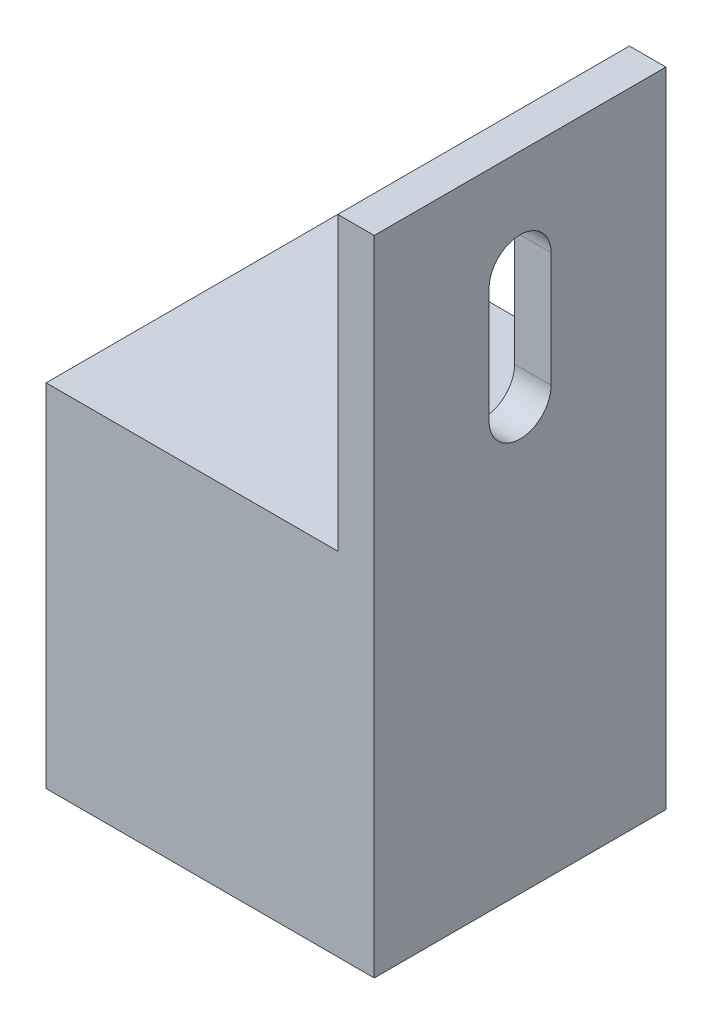
ISO-10303-21;
HEADER;
FILE_DESCRIPTION(('STEP AP214'),'2;1');
FILE_NAME('part.step','',(''),(''),'','','');
FILE_SCHEMA(('AUTOMOTIVE_DESIGN { 1 0 10303 214 1 1 1 1 }'));
ENDSEC;
DATA;
#1=APPLICATION_CONTEXT('core data for automotive mechanical design processes');
#2=APPLICATION_PROTOCOL_DEFINITION('international standard','automotive_design',2000,#1);
#3=PRODUCT_CONTEXT('',#1,'mechanical');
#4=PRODUCT('Part','Part','',(#3));
#5=PRODUCT_RELATED_PRODUCT_CATEGORY('part','',(#4));
#6=PRODUCT_DEFINITION_FORMATION('','',#4);
#7=PRODUCT_DEFINITION_CONTEXT('part definition',#1,'design');
#8=PRODUCT_DEFINITION('design','',#6,#7);
#9=PRODUCT_DEFINITION_SHAPE('','',#8);
#10=(LENGTH_UNIT() NAMED_UNIT(*) SI_UNIT(.MILLI.,.METRE.));
#11=(NAMED_UNIT(*) PLANE_ANGLE_UNIT() SI_UNIT($,.RADIAN.));
#12=(NAMED_UNIT(*) SI_UNIT($,.STERADIAN.) SOLID_ANGLE_UNIT());
#13=UNCERTAINTY_MEASURE_WITH_UNIT(LENGTH_MEASURE(1.E-05),#10,'distance_accuracy_value','');
#14=(GEOMETRIC_REPRESENTATION_CONTEXT(3) GLOBAL_UNCERTAINTY_ASSIGNED_CONTEXT((#13)) GLOBAL_UNIT_ASSIGNED_CONTEXT((#10,
#11,#12)) REPRESENTATION_CONTEXT('',''));
#15=CARTESIAN_POINT('',(0.,0.,0.));
#16=DIRECTION('',(0.,0.,1.));
#17=DIRECTION('',(1.,0.,0.));
#18=AXIS2_PLACEMENT_3D('',#15,#16,#17);
#19=CARTESIAN_POINT('',(-12.7,30.6,-12.7));
#20=DIRECTION('',(0.,0.,1.));
#21=DIRECTION('',(1.,0.,0.));
#22=AXIS2_PLACEMENT_3D('',#19,#20,#21);
#23=PLANE('',#22);
#24=DIRECTION('',(-1.,0.,0.));
#25=VECTOR('',#24,1.);
#26=CARTESIAN_POINT('',(-12.7,0.,-12.7));
#27=LINE('',#26,#25);
#28=CARTESIAN_POINT('',(15.875,0.,-12.7));
#29=VERTEX_POINT('',#28);
#30=CARTESIAN_POINT('',(-12.7,0.,-12.7));
#31=VERTEX_POINT('',#30);
#32=EDGE_CURVE('E67',#29,#31,#27,.T.);
#33=ORIENTED_EDGE('',*,*,#32,.T.);
#34=DIRECTION('',(0.,-1.,0.));
#35=VECTOR('',#34,1.);
#36=CARTESIAN_POINT('',(-12.7,30.6,-12.7));
#37=LINE('',#36,#35);
#38=CARTESIAN_POINT('',(-12.7,30.6,-12.7));
#39=VERTEX_POINT('',#38);
#40=EDGE_CURVE('E11',#39,#31,#37,.T.);
#41=ORIENTED_EDGE('',*,*,#40,.F.);
#42=DIRECTION('',(-1.,0.,0.));
#43=VECTOR('',#42,1.);
#44=CARTESIAN_POINT('',(-12.7,30.6,-12.7));
#45=LINE('',#44,#43);
#46=CARTESIAN_POINT('',(12.7,30.6,-12.7));
#47=VERTEX_POINT('',#46);
#48=EDGE_CURVE('E94',#47,#39,#45,.T.);
#49=ORIENTED_EDGE('',*,*,#48,.F.);
#50=DIRECTION('',(0.,1.,0.));
#51=VECTOR('',#50,1.);
#52=CARTESIAN_POINT('',(12.7,0.,-12.7));
#53=LINE('',#52,#51);
#54=CARTESIAN_POINT('',(12.7,56.,-12.7));
#55=VERTEX_POINT('',#54);
#56=EDGE_CURVE('E84',#47,#55,#53,.T.);
#57=ORIENTED_EDGE('',*,*,#56,.T.);
#58=DIRECTION('',(-1.,0.,0.));
#59=VECTOR('',#58,1.);
#60=CARTESIAN_POINT('',(15.875,56.,-12.7));
#61=LINE('',#60,#59);
#62=CARTESIAN_POINT('',(15.875,56.,-12.7));
#63=VERTEX_POINT('',#62);
#64=EDGE_CURVE('E105',#63,#55,#61,.T.);
#65=ORIENTED_EDGE('',*,*,#64,.F.);
#66=DIRECTION('',(0.,1.,0.));
#67=VECTOR('',#66,1.);
#68=CARTESIAN_POINT('',(15.875,0.,-12.7));
#69=LINE('',#68,#67);
#70=EDGE_CURVE('E130',#29,#63,#69,.T.);
#71=ORIENTED_EDGE('',*,*,#70,.F.);
#72=EDGE_LOOP('',(#33,#41,#49,#57,#65,#71));
#73=FACE_BOUND('',#72,.T.);
#74=ADVANCED_FACE('F39',(#73),#23,.F.);
#75=CARTESIAN_POINT('',(-12.7,30.6,-12.7));
#76=DIRECTION('',(1.,0.,0.));
#77=DIRECTION('',(0.,0.,-1.));
#78=AXIS2_PLACEMENT_3D('',#75,#76,#77);
#79=PLANE('',#78);
#80=DIRECTION('',(0.,0.,1.));
#81=VECTOR('',#80,1.);
#82=CARTESIAN_POINT('',(-12.7,0.,-12.7));
#83=LINE('',#82,#81);
#84=CARTESIAN_POINT('',(-12.7,0.,12.7));
#85=VERTEX_POINT('',#84);
#86=EDGE_CURVE('E102',#31,#85,#83,.T.);
#87=ORIENTED_EDGE('',*,*,#86,.T.);
#88=DIRECTION('',(0.,-1.,0.));
#89=VECTOR('',#88,1.);
#90=CARTESIAN_POINT('',(-12.7,30.6,12.7));
#91=LINE('',#90,#89);
#92=CARTESIAN_POINT('',(-12.7,30.6,12.7));
#93=VERTEX_POINT('',#92);
#94=EDGE_CURVE('E47',#93,#85,#91,.T.);
#95=ORIENTED_EDGE('',*,*,#94,.F.);
#96=DIRECTION('',(0.,0.,1.));
#97=VECTOR('',#96,1.);
#98=CARTESIAN_POINT('',(-12.7,30.6,-12.7));
#99=LINE('',#98,#97);
#100=EDGE_CURVE('E55',#39,#93,#99,.T.);
#101=ORIENTED_EDGE('',*,*,#100,.F.);
#102=ORIENTED_EDGE('',*,*,#40,.T.);
#103=EDGE_LOOP('',(#87,#95,#101,#102));
#104=FACE_BOUND('',#103,.T.);
#105=ADVANCED_FACE('F233',(#104),#79,.F.);
#106=CARTESIAN_POINT('',(-12.7,30.6,12.7));
#107=DIRECTION('',(0.,0.,-1.));
#108=DIRECTION('',(-1.,0.,0.));
#109=AXIS2_PLACEMENT_3D('',#106,#107,#108);
#110=PLANE('',#109);
#111=DIRECTION('',(1.,0.,0.));
#112=VECTOR('',#111,1.);
#113=CARTESIAN_POINT('',(-12.7,0.,12.7));
#114=LINE('',#113,#112);
#115=CARTESIAN_POINT('',(15.875,0.,12.7));
#116=VERTEX_POINT('',#115);
#117=EDGE_CURVE('E99',#85,#116,#114,.T.);
#118=ORIENTED_EDGE('',*,*,#117,.T.);
#119=DIRECTION('',(0.,-1.,0.));
#120=VECTOR('',#119,1.);
#121=CARTESIAN_POINT('',(15.875,0.,12.7));
#122=LINE('',#121,#120);
#123=CARTESIAN_POINT('',(15.875,56.,12.7));
#124=VERTEX_POINT('',#123);
#125=EDGE_CURVE('E131',#124,#116,#122,.T.);
#126=ORIENTED_EDGE('',*,*,#125,.F.);
#127=DIRECTION('',(-1.,0.,0.));
#128=VECTOR('',#127,1.);
#129=CARTESIAN_POINT('',(15.875,56.,12.7));
#130=LINE('',#129,#128);
#131=CARTESIAN_POINT('',(12.7,56.,12.7));
#132=VERTEX_POINT('',#131);
#133=EDGE_CURVE('E149',#124,#132,#130,.T.);
#134=ORIENTED_EDGE('',*,*,#133,.T.);
#135=DIRECTION('',(0.,-1.,0.));
#136=VECTOR('',#135,1.);
#137=CARTESIAN_POINT('',(12.7,0.,12.7));
#138=LINE('',#137,#136);
#139=CARTESIAN_POINT('',(12.7,30.6,12.7));
#140=VERTEX_POINT('',#139);
#141=EDGE_CURVE('E92',#132,#140,#138,.T.);
#142=ORIENTED_EDGE('',*,*,#141,.T.);
#143=DIRECTION('',(1.,0.,0.));
#144=VECTOR('',#143,1.);
#145=CARTESIAN_POINT('',(-12.7,30.6,12.7));
#146=LINE('',#145,#144);
#147=EDGE_CURVE('E98',#93,#140,#146,.T.);
#148=ORIENTED_EDGE('',*,*,#147,.F.);
#149=ORIENTED_EDGE('',*,*,#94,.T.);
#150=EDGE_LOOP('',(#118,#126,#134,#142,#148,#149));
#151=FACE_BOUND('',#150,.T.);
#152=ADVANCED_FACE('F114',(#151),#110,.F.);
#153=CARTESIAN_POINT('',(0.,30.6,0.));
#154=DIRECTION('',(0.,1.,0.));
#155=DIRECTION('',(0.,0.,1.));
#156=AXIS2_PLACEMENT_3D('',#153,#154,#155);
#157=PLANE('',#156);
#158=DIRECTION('',(0.,0.,-1.));
#159=VECTOR('',#158,1.);
#160=CARTESIAN_POINT('',(12.7,30.6,-12.7));
#161=LINE('',#160,#159);
#162=EDGE_CURVE('E76',#140,#47,#161,.T.);
#163=ORIENTED_EDGE('',*,*,#162,.T.);
#164=ORIENTED_EDGE('',*,*,#48,.T.);
#165=ORIENTED_EDGE('',*,*,#100,.T.);
#166=ORIENTED_EDGE('',*,*,#147,.T.);
#167=EDGE_LOOP('',(#163,#164,#165,#166));
#168=FACE_BOUND('',#167,.T.);
#169=ADVANCED_FACE('F96',(#168),#157,.T.);
#170=CARTESIAN_POINT('',(0.,0.,0.));
#171=DIRECTION('',(0.,1.,0.));
#172=DIRECTION('',(0.,0.,1.));
#173=AXIS2_PLACEMENT_3D('',#170,#171,#172);
#174=PLANE('',#173);
#175=ORIENTED_EDGE('',*,*,#32,.F.);
#176=DIRECTION('',(0.,0.,-1.));
#177=VECTOR('',#176,1.);
#178=CARTESIAN_POINT('',(15.875,0.,12.7));
#179=LINE('',#178,#177);
#180=EDGE_CURVE('E123',#116,#29,#179,.T.);
#181=ORIENTED_EDGE('',*,*,#180,.F.);
#182=ORIENTED_EDGE('',*,*,#117,.F.);
#183=ORIENTED_EDGE('',*,*,#86,.F.);
#184=EDGE_LOOP('',(#175,#181,#182,#183));
#185=FACE_BOUND('',#184,.T.);
#186=ADVANCED_FACE('F121',(#185),#174,.F.);
#187=CARTESIAN_POINT('',(12.7,0.,0.));
#188=DIRECTION('',(-1.,0.,0.));
#189=DIRECTION('',(0.,0.,1.));
#190=AXIS2_PLACEMENT_3D('',#187,#188,#189);
#191=PLANE('',#190);
#192=DIRECTION('',(0.,1.,0.));
#193=VECTOR('',#192,1.);
#194=CARTESIAN_POINT('',(12.7,47.,-2.7));
#195=LINE('',#194,#193);
#196=CARTESIAN_POINT('',(12.7,37.,-2.7));
#197=VERTEX_POINT('',#196);
#198=CARTESIAN_POINT('',(12.7,47.,-2.7));
#199=VERTEX_POINT('',#198);
#200=EDGE_CURVE('E182',#197,#199,#195,.T.);
#201=ORIENTED_EDGE('',*,*,#200,.T.);
#202=CARTESIAN_POINT('',(12.7,47.,0.));
#203=DIRECTION('',(1.,0.,0.));
#204=DIRECTION('',(0.,0.,-1.));
#205=AXIS2_PLACEMENT_3D('',#202,#203,#204);
#206=CIRCLE('',#205,2.7);
#207=CARTESIAN_POINT('',(12.7,47.,2.7));
#208=VERTEX_POINT('',#207);
#209=EDGE_CURVE('E164',#199,#208,#206,.T.);
#210=ORIENTED_EDGE('',*,*,#209,.T.);
#211=DIRECTION('',(0.,-1.,0.));
#212=VECTOR('',#211,1.);
#213=CARTESIAN_POINT('',(12.7,47.,2.7));
#214=LINE('',#213,#212);
#215=CARTESIAN_POINT('',(12.7,37.,2.69999999999999));
#216=VERTEX_POINT('',#215);
#217=EDGE_CURVE('E175',#208,#216,#214,.T.);
#218=ORIENTED_EDGE('',*,*,#217,.T.);
#219=CARTESIAN_POINT('',(12.7,37.,0.));
#220=DIRECTION('',(1.,0.,0.));
#221=DIRECTION('',(0.,0.,-1.));
#222=AXIS2_PLACEMENT_3D('',#219,#220,#221);
#223=CIRCLE('',#222,2.7);
#224=EDGE_CURVE('E189',#216,#197,#223,.T.);
#225=ORIENTED_EDGE('',*,*,#224,.T.);
#226=EDGE_LOOP('',(#201,#210,#218,#225));
#227=FACE_BOUND('',#226,.T.);
#228=ORIENTED_EDGE('',*,*,#162,.F.);
#229=ORIENTED_EDGE('',*,*,#141,.F.);
#230=DIRECTION('',(0.,0.,1.));
#231=VECTOR('',#230,1.);
#232=CARTESIAN_POINT('',(12.7,56.,12.7));
#233=LINE('',#232,#231);
#234=EDGE_CURVE('E89',#55,#132,#233,.T.);
#235=ORIENTED_EDGE('',*,*,#234,.F.);
#236=ORIENTED_EDGE('',*,*,#56,.F.);
#237=EDGE_LOOP('',(#228,#229,#235,#236));
#238=FACE_BOUND('',#237,.T.);
#239=ADVANCED_FACE('F86',(#227,#238),#191,.T.);
#240=CARTESIAN_POINT('',(15.875,0.,0.));
#241=DIRECTION('',(-1.,0.,0.));
#242=DIRECTION('',(0.,0.,1.));
#243=AXIS2_PLACEMENT_3D('',#240,#241,#242);
#244=PLANE('',#243);
#245=ORIENTED_EDGE('',*,*,#125,.T.);
#246=ORIENTED_EDGE('',*,*,#180,.T.);
#247=ORIENTED_EDGE('',*,*,#70,.T.);
#248=DIRECTION('',(0.,0.,1.));
#249=VECTOR('',#248,1.);
#250=CARTESIAN_POINT('',(15.875,56.,12.7));
#251=LINE('',#250,#249);
#252=EDGE_CURVE('E138',#63,#124,#251,.T.);
#253=ORIENTED_EDGE('',*,*,#252,.T.);
#254=EDGE_LOOP('',(#245,#246,#247,#253));
#255=FACE_BOUND('',#254,.T.);
#256=CARTESIAN_POINT('',(15.875,47.,0.));
#257=DIRECTION('',(1.,0.,0.));
#258=DIRECTION('',(0.,0.,-1.));
#259=AXIS2_PLACEMENT_3D('',#256,#257,#258);
#260=CIRCLE('',#259,2.7);
#261=CARTESIAN_POINT('',(15.875,47.,-2.7));
#262=VERTEX_POINT('',#261);
#263=CARTESIAN_POINT('',(15.875,47.,2.7));
#264=VERTEX_POINT('',#263);
#265=EDGE_CURVE('E190',#262,#264,#260,.T.);
#266=ORIENTED_EDGE('',*,*,#265,.F.);
#267=DIRECTION('',(0.,1.,0.));
#268=VECTOR('',#267,1.);
#269=CARTESIAN_POINT('',(15.875,47.,-2.7));
#270=LINE('',#269,#268);
#271=CARTESIAN_POINT('',(15.875,37.,-2.7));
#272=VERTEX_POINT('',#271);
#273=EDGE_CURVE('E185',#272,#262,#270,.T.);
#274=ORIENTED_EDGE('',*,*,#273,.F.);
#275=CARTESIAN_POINT('',(15.875,37.,0.));
#276=DIRECTION('',(1.,0.,0.));
#277=DIRECTION('',(0.,0.,-1.));
#278=AXIS2_PLACEMENT_3D('',#275,#276,#277);
#279=CIRCLE('',#278,2.7);
#280=CARTESIAN_POINT('',(15.875,37.,2.69999999999999));
#281=VERTEX_POINT('',#280);
#282=EDGE_CURVE('E215',#281,#272,#279,.T.);
#283=ORIENTED_EDGE('',*,*,#282,.F.);
#284=DIRECTION('',(0.,-1.,0.));
#285=VECTOR('',#284,1.);
#286=CARTESIAN_POINT('',(15.875,47.,2.7));
#287=LINE('',#286,#285);
#288=EDGE_CURVE('E192',#264,#281,#287,.T.);
#289=ORIENTED_EDGE('',*,*,#288,.F.);
#290=EDGE_LOOP('',(#266,#274,#283,#289));
#291=FACE_BOUND('',#290,.T.);
#292=ADVANCED_FACE('F134',(#255,#291),#244,.F.);
#293=CARTESIAN_POINT('',(15.875,56.,12.7));
#294=DIRECTION('',(0.,-1.,0.));
#295=DIRECTION('',(0.,0.,-1.));
#296=AXIS2_PLACEMENT_3D('',#293,#294,#295);
#297=PLANE('',#296);
#298=ORIENTED_EDGE('',*,*,#234,.T.);
#299=ORIENTED_EDGE('',*,*,#133,.F.);
#300=ORIENTED_EDGE('',*,*,#252,.F.);
#301=ORIENTED_EDGE('',*,*,#64,.T.);
#302=EDGE_LOOP('',(#298,#299,#300,#301));
#303=FACE_BOUND('',#302,.T.);
#304=ADVANCED_FACE('F151',(#303),#297,.F.);
#305=CARTESIAN_POINT('',(15.875,47.,0.));
#306=DIRECTION('',(-1.,0.,0.));
#307=DIRECTION('',(0.,0.,1.));
#308=AXIS2_PLACEMENT_3D('',#305,#306,#307);
#309=CYLINDRICAL_SURFACE('',#308,2.7);
#310=ORIENTED_EDGE('',*,*,#209,.F.);
#311=DIRECTION('',(-1.,0.,0.));
#312=VECTOR('',#311,1.);
#313=CARTESIAN_POINT('',(15.875,47.,-2.7));
#314=LINE('',#313,#312);
#315=EDGE_CURVE('E168',#262,#199,#314,.T.);
#316=ORIENTED_EDGE('',*,*,#315,.F.);
#317=ORIENTED_EDGE('',*,*,#265,.T.);
#318=DIRECTION('',(-1.,0.,0.));
#319=VECTOR('',#318,1.);
#320=CARTESIAN_POINT('',(15.875,47.,2.7));
#321=LINE('',#320,#319);
#322=EDGE_CURVE('E144',#264,#208,#321,.T.);
#323=ORIENTED_EDGE('',*,*,#322,.T.);
#324=EDGE_LOOP('',(#310,#316,#317,#323));
#325=FACE_BOUND('',#324,.T.);
#326=ADVANCED_FACE('F166',(#325),#309,.F.);
#327=CARTESIAN_POINT('',(15.875,47.,2.7));
#328=DIRECTION('',(0.,0.,-1.));
#329=DIRECTION('',(0.,1.,0.));
#330=AXIS2_PLACEMENT_3D('',#327,#328,#329);
#331=PLANE('',#330);
#332=ORIENTED_EDGE('',*,*,#217,.F.);
#333=ORIENTED_EDGE('',*,*,#322,.F.);
#334=ORIENTED_EDGE('',*,*,#288,.T.);
#335=DIRECTION('',(-1.,0.,0.));
#336=VECTOR('',#335,1.);
#337=CARTESIAN_POINT('',(15.875,37.,2.69999999999999));
#338=LINE('',#337,#336);
#339=EDGE_CURVE('E198',#281,#216,#338,.T.);
#340=ORIENTED_EDGE('',*,*,#339,.T.);
#341=EDGE_LOOP('',(#332,#333,#334,#340));
#342=FACE_BOUND('',#341,.T.);
#343=ADVANCED_FACE('F205',(#342),#331,.T.);
#344=CARTESIAN_POINT('',(15.875,37.,0.));
#345=DIRECTION('',(-1.,0.,0.));
#346=DIRECTION('',(0.,0.,1.));
#347=AXIS2_PLACEMENT_3D('',#344,#345,#346);
#348=CYLINDRICAL_SURFACE('',#347,2.7);
#349=ORIENTED_EDGE('',*,*,#224,.F.);
#350=ORIENTED_EDGE('',*,*,#339,.F.);
#351=ORIENTED_EDGE('',*,*,#282,.T.);
#352=DIRECTION('',(-1.,0.,0.));
#353=VECTOR('',#352,1.);
#354=CARTESIAN_POINT('',(15.875,37.,-2.7));
#355=LINE('',#354,#353);
#356=EDGE_CURVE('E186',#272,#197,#355,.T.);
#357=ORIENTED_EDGE('',*,*,#356,.T.);
#358=EDGE_LOOP('',(#349,#350,#351,#357));
#359=FACE_BOUND('',#358,.T.);
#360=ADVANCED_FACE('F212',(#359),#348,.F.);
#361=CARTESIAN_POINT('',(15.875,47.,-2.7));
#362=DIRECTION('',(0.,0.,1.));
#363=DIRECTION('',(0.,-1.,0.));
#364=AXIS2_PLACEMENT_3D('',#361,#362,#363);
#365=PLANE('',#364);
#366=ORIENTED_EDGE('',*,*,#200,.F.);
#367=ORIENTED_EDGE('',*,*,#356,.F.);
#368=ORIENTED_EDGE('',*,*,#273,.T.);
#369=ORIENTED_EDGE('',*,*,#315,.T.);
#370=EDGE_LOOP('',(#366,#367,#368,#369));
#371=FACE_BOUND('',#370,.T.);
#372=ADVANCED_FACE('F180',(#371),#365,.T.);
#373=CLOSED_SHELL('',(#74,#105,#152,#169,#186,#239,#292,#304,#326,#343,#360,#372));
#374=MANIFOLD_SOLID_BREP('B2',#373);
#375=ADVANCED_BREP_SHAPE_REPRESENTATION('',(#18,#374),#14);
#376=SHAPE_DEFINITION_REPRESENTATION(#9,#375);
ENDSEC;
END-ISO-10303-21;
